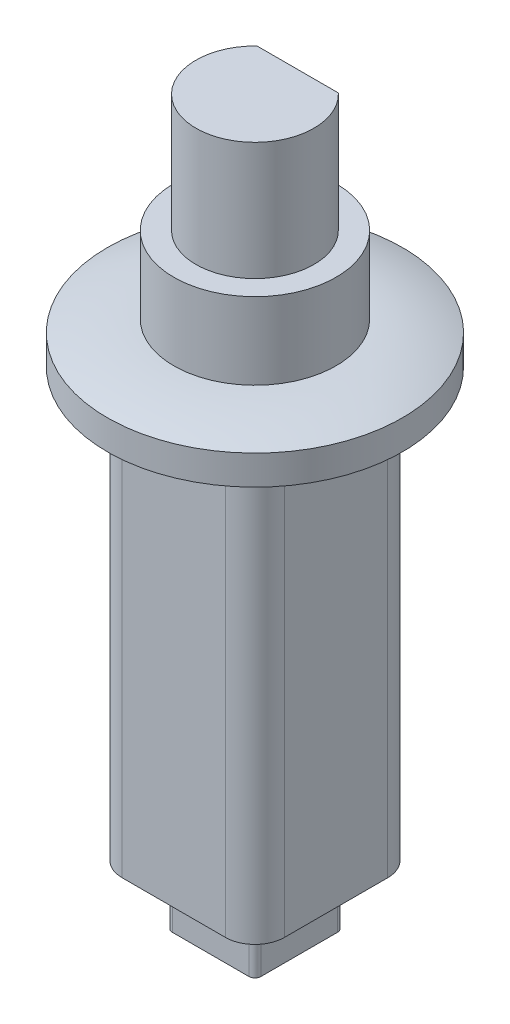
ISO-10303-21;
HEADER;
FILE_DESCRIPTION(('STEP AP214'),'2;1');
FILE_NAME('part.step','',(''),(''),'','','');
FILE_SCHEMA(('AUTOMOTIVE_DESIGN { 1 0 10303 214 1 1 1 1 }'));
ENDSEC;
DATA;
#1=APPLICATION_CONTEXT('core data for automotive mechanical design processes');
#2=APPLICATION_PROTOCOL_DEFINITION('international standard','automotive_design',2000,#1);
#3=PRODUCT_CONTEXT('',#1,'mechanical');
#4=PRODUCT('Part','Part','',(#3));
#5=PRODUCT_RELATED_PRODUCT_CATEGORY('part','',(#4));
#6=PRODUCT_DEFINITION_FORMATION('','',#4);
#7=PRODUCT_DEFINITION_CONTEXT('part definition',#1,'design');
#8=PRODUCT_DEFINITION('design','',#6,#7);
#9=PRODUCT_DEFINITION_SHAPE('','',#8);
#10=(LENGTH_UNIT() NAMED_UNIT(*) SI_UNIT(.MILLI.,.METRE.));
#11=(NAMED_UNIT(*) PLANE_ANGLE_UNIT() SI_UNIT($,.RADIAN.));
#12=(NAMED_UNIT(*) SI_UNIT($,.STERADIAN.) SOLID_ANGLE_UNIT());
#13=UNCERTAINTY_MEASURE_WITH_UNIT(LENGTH_MEASURE(1.E-05),#10,'distance_accuracy_value','');
#14=(GEOMETRIC_REPRESENTATION_CONTEXT(3) GLOBAL_UNCERTAINTY_ASSIGNED_CONTEXT((#13)) GLOBAL_UNIT_ASSIGNED_CONTEXT((#10,
#11,#12)) REPRESENTATION_CONTEXT('',''));
#15=CARTESIAN_POINT('',(0.,0.,0.));
#16=DIRECTION('',(0.,0.,1.));
#17=DIRECTION('',(1.,0.,0.));
#18=AXIS2_PLACEMENT_3D('',#15,#16,#17);
#19=CARTESIAN_POINT('',(1.75,-14.5,1.75));
#20=DIRECTION('',(0.,1.,0.));
#21=DIRECTION('',(-1.,0.,0.));
#22=AXIS2_PLACEMENT_3D('',#19,#20,#21);
#23=PLANE('',#22);
#24=CARTESIAN_POINT('',(1.75,-14.5,1.75));
#25=DIRECTION('',(0.,-1.,0.));
#26=DIRECTION('',(-1.,0.,0.));
#27=AXIS2_PLACEMENT_3D('',#24,#25,#26);
#28=CIRCLE('',#27,1.);
#29=CARTESIAN_POINT('',(2.75,-14.5,1.74999999999999));
#30=VERTEX_POINT('',#29);
#31=CARTESIAN_POINT('',(1.74999999999999,-14.5,2.75));
#32=VERTEX_POINT('',#31);
#33=EDGE_CURVE('E186',#30,#32,#28,.T.);
#34=ORIENTED_EDGE('',*,*,#33,.T.);
#35=DIRECTION('',(-1.,0.,0.));
#36=VECTOR('',#35,1.);
#37=CARTESIAN_POINT('',(-1.74999999999999,-14.5,2.75));
#38=LINE('',#37,#36);
#39=CARTESIAN_POINT('',(-1.74999999999999,-14.5,2.75));
#40=VERTEX_POINT('',#39);
#41=EDGE_CURVE('E189',#32,#40,#38,.T.);
#42=ORIENTED_EDGE('',*,*,#41,.T.);
#43=CARTESIAN_POINT('',(-1.75,-14.5,1.75));
#44=DIRECTION('',(0.,-1.,0.));
#45=DIRECTION('',(-1.,0.,0.));
#46=AXIS2_PLACEMENT_3D('',#43,#44,#45);
#47=CIRCLE('',#46,1.);
#48=CARTESIAN_POINT('',(-2.75,-14.5,1.74999999999999));
#49=VERTEX_POINT('',#48);
#50=EDGE_CURVE('E192',#40,#49,#47,.T.);
#51=ORIENTED_EDGE('',*,*,#50,.T.);
#52=DIRECTION('',(0.,0.,-1.));
#53=VECTOR('',#52,1.);
#54=CARTESIAN_POINT('',(-2.75,-14.5,-1.74999999999999));
#55=LINE('',#54,#53);
#56=CARTESIAN_POINT('',(-2.75,-14.5,-1.74999999999999));
#57=VERTEX_POINT('',#56);
#58=EDGE_CURVE('E194',#49,#57,#55,.T.);
#59=ORIENTED_EDGE('',*,*,#58,.T.);
#60=CARTESIAN_POINT('',(-1.75,-14.5,-1.75));
#61=DIRECTION('',(0.,-1.,0.));
#62=DIRECTION('',(-1.,0.,0.));
#63=AXIS2_PLACEMENT_3D('',#60,#61,#62);
#64=CIRCLE('',#63,1.);
#65=CARTESIAN_POINT('',(-1.74999999999999,-14.5,-2.75));
#66=VERTEX_POINT('',#65);
#67=EDGE_CURVE('E196',#57,#66,#64,.T.);
#68=ORIENTED_EDGE('',*,*,#67,.T.);
#69=DIRECTION('',(1.,0.,0.));
#70=VECTOR('',#69,1.);
#71=CARTESIAN_POINT('',(-1.74999999999999,-14.5,-2.75));
#72=LINE('',#71,#70);
#73=CARTESIAN_POINT('',(1.74999999999999,-14.5,-2.75));
#74=VERTEX_POINT('',#73);
#75=EDGE_CURVE('E198',#66,#74,#72,.T.);
#76=ORIENTED_EDGE('',*,*,#75,.T.);
#77=CARTESIAN_POINT('',(1.75,-14.5,-1.75));
#78=DIRECTION('',(0.,-1.,0.));
#79=DIRECTION('',(1.,0.,0.));
#80=AXIS2_PLACEMENT_3D('',#77,#78,#79);
#81=CIRCLE('',#80,1.);
#82=CARTESIAN_POINT('',(2.75,-14.5,-1.75));
#83=VERTEX_POINT('',#82);
#84=EDGE_CURVE('E200',#74,#83,#81,.T.);
#85=ORIENTED_EDGE('',*,*,#84,.T.);
#86=DIRECTION('',(0.,0.,1.));
#87=VECTOR('',#86,1.);
#88=CARTESIAN_POINT('',(2.75,-14.5,-1.74999999999999));
#89=LINE('',#88,#87);
#90=EDGE_CURVE('E202',#83,#30,#89,.T.);
#91=ORIENTED_EDGE('',*,*,#90,.T.);
#92=EDGE_LOOP('',(#34,#42,#51,#59,#68,#76,#85,#91));
#93=FACE_BOUND('',#92,.T.);
#94=CARTESIAN_POINT('',(1.3,-14.5,1.3));
#95=DIRECTION('',(0.,-1.,0.));
#96=DIRECTION('',(1.,0.,0.));
#97=AXIS2_PLACEMENT_3D('',#94,#95,#96);
#98=CIRCLE('',#97,0.2);
#99=CARTESIAN_POINT('',(1.5,-14.5,1.3));
#100=VERTEX_POINT('',#99);
#101=CARTESIAN_POINT('',(1.3,-14.5,1.5));
#102=VERTEX_POINT('',#101);
#103=EDGE_CURVE('E47',#100,#102,#98,.T.);
#104=ORIENTED_EDGE('',*,*,#103,.F.);
#105=DIRECTION('',(0.,0.,1.));
#106=VECTOR('',#105,1.);
#107=CARTESIAN_POINT('',(1.5,-14.5,-1.3));
#108=LINE('',#107,#106);
#109=CARTESIAN_POINT('',(1.5,-14.5,-1.3));
#110=VERTEX_POINT('',#109);
#111=EDGE_CURVE('E51',#110,#100,#108,.T.);
#112=ORIENTED_EDGE('',*,*,#111,.F.);
#113=CARTESIAN_POINT('',(1.3,-14.5,-1.3));
#114=DIRECTION('',(0.,-1.,0.));
#115=DIRECTION('',(1.,0.,0.));
#116=AXIS2_PLACEMENT_3D('',#113,#114,#115);
#117=CIRCLE('',#116,0.2);
#118=CARTESIAN_POINT('',(1.3,-14.5,-1.5));
#119=VERTEX_POINT('',#118);
#120=EDGE_CURVE('E531',#119,#110,#117,.T.);
#121=ORIENTED_EDGE('',*,*,#120,.F.);
#122=DIRECTION('',(1.,0.,0.));
#123=VECTOR('',#122,1.);
#124=CARTESIAN_POINT('',(1.3,-14.5,-1.5));
#125=LINE('',#124,#123);
#126=CARTESIAN_POINT('',(-1.3,-14.5,-1.5));
#127=VERTEX_POINT('',#126);
#128=EDGE_CURVE('E565',#127,#119,#125,.T.);
#129=ORIENTED_EDGE('',*,*,#128,.F.);
#130=CARTESIAN_POINT('',(-1.3,-14.5,-1.3));
#131=DIRECTION('',(0.,-1.,0.));
#132=DIRECTION('',(-1.,0.,0.));
#133=AXIS2_PLACEMENT_3D('',#130,#131,#132);
#134=CIRCLE('',#133,0.2);
#135=CARTESIAN_POINT('',(-1.5,-14.5,-1.3));
#136=VERTEX_POINT('',#135);
#137=EDGE_CURVE('E558',#136,#127,#134,.T.);
#138=ORIENTED_EDGE('',*,*,#137,.F.);
#139=DIRECTION('',(0.,0.,-1.));
#140=VECTOR('',#139,1.);
#141=CARTESIAN_POINT('',(-1.5,-14.5,-1.3));
#142=LINE('',#141,#140);
#143=CARTESIAN_POINT('',(-1.5,-14.5,1.3));
#144=VERTEX_POINT('',#143);
#145=EDGE_CURVE('E552',#144,#136,#142,.T.);
#146=ORIENTED_EDGE('',*,*,#145,.F.);
#147=CARTESIAN_POINT('',(-1.3,-14.5,1.3));
#148=DIRECTION('',(0.,-1.,0.));
#149=DIRECTION('',(1.,0.,0.));
#150=AXIS2_PLACEMENT_3D('',#147,#148,#149);
#151=CIRCLE('',#150,0.2);
#152=CARTESIAN_POINT('',(-1.3,-14.5,1.5));
#153=VERTEX_POINT('',#152);
#154=EDGE_CURVE('E555',#153,#144,#151,.T.);
#155=ORIENTED_EDGE('',*,*,#154,.F.);
#156=DIRECTION('',(-1.,0.,0.));
#157=VECTOR('',#156,1.);
#158=CARTESIAN_POINT('',(1.3,-14.5,1.5));
#159=LINE('',#158,#157);
#160=EDGE_CURVE('E556',#102,#153,#159,.T.);
#161=ORIENTED_EDGE('',*,*,#160,.F.);
#162=EDGE_LOOP('',(#104,#112,#121,#129,#138,#146,#155,#161));
#163=FACE_BOUND('',#162,.T.);
#164=ADVANCED_FACE('F32',(#93,#163),#23,.F.);
#165=CARTESIAN_POINT('',(5.,0.,0.));
#166=DIRECTION('',(0.,1.,0.));
#167=DIRECTION('',(-1.,0.,0.));
#168=AXIS2_PLACEMENT_3D('',#165,#166,#167);
#169=PLANE('',#168);
#170=CARTESIAN_POINT('',(0.,0.,0.));
#171=DIRECTION('',(0.,1.,0.));
#172=DIRECTION('',(-1.,0.,0.));
#173=AXIS2_PLACEMENT_3D('',#170,#171,#172);
#174=CIRCLE('',#173,5.);
#175=CARTESIAN_POINT('',(-5.,0.,0.));
#176=VERTEX_POINT('',#175);
#177=EDGE_CURVE('E256',#176,#176,#174,.T.);
#178=ORIENTED_EDGE('',*,*,#177,.F.);
#179=EDGE_LOOP('',(#178));
#180=FACE_BOUND('',#179,.T.);
#181=CARTESIAN_POINT('',(1.75,0.,1.75));
#182=DIRECTION('',(0.,-1.,0.));
#183=DIRECTION('',(-1.,0.,0.));
#184=AXIS2_PLACEMENT_3D('',#181,#182,#183);
#185=CIRCLE('',#184,1.);
#186=CARTESIAN_POINT('',(2.75,0.,1.74999999999999));
#187=VERTEX_POINT('',#186);
#188=CARTESIAN_POINT('',(1.74999999999999,0.,2.75));
#189=VERTEX_POINT('',#188);
#190=EDGE_CURVE('E177',#187,#189,#185,.T.);
#191=ORIENTED_EDGE('',*,*,#190,.F.);
#192=DIRECTION('',(0.,0.,1.));
#193=VECTOR('',#192,1.);
#194=CARTESIAN_POINT('',(2.75,0.,-1.74999999999999));
#195=LINE('',#194,#193);
#196=CARTESIAN_POINT('',(2.75,0.,-1.75));
#197=VERTEX_POINT('',#196);
#198=EDGE_CURVE('E190',#197,#187,#195,.T.);
#199=ORIENTED_EDGE('',*,*,#198,.F.);
#200=CARTESIAN_POINT('',(1.75,0.,-1.75));
#201=DIRECTION('',(0.,-1.,0.));
#202=DIRECTION('',(1.,0.,0.));
#203=AXIS2_PLACEMENT_3D('',#200,#201,#202);
#204=CIRCLE('',#203,1.);
#205=CARTESIAN_POINT('',(1.74999999999999,0.,-2.75));
#206=VERTEX_POINT('',#205);
#207=EDGE_CURVE('E219',#206,#197,#204,.T.);
#208=ORIENTED_EDGE('',*,*,#207,.F.);
#209=DIRECTION('',(1.,0.,0.));
#210=VECTOR('',#209,1.);
#211=CARTESIAN_POINT('',(-1.74999999999999,0.,-2.75));
#212=LINE('',#211,#210);
#213=CARTESIAN_POINT('',(-1.74999999999999,0.,-2.75));
#214=VERTEX_POINT('',#213);
#215=EDGE_CURVE('E216',#214,#206,#212,.T.);
#216=ORIENTED_EDGE('',*,*,#215,.F.);
#217=CARTESIAN_POINT('',(-1.75,0.,-1.75));
#218=DIRECTION('',(0.,-1.,0.));
#219=DIRECTION('',(-1.,0.,0.));
#220=AXIS2_PLACEMENT_3D('',#217,#218,#219);
#221=CIRCLE('',#220,1.);
#222=CARTESIAN_POINT('',(-2.75,0.,-1.74999999999999));
#223=VERTEX_POINT('',#222);
#224=EDGE_CURVE('E213',#223,#214,#221,.T.);
#225=ORIENTED_EDGE('',*,*,#224,.F.);
#226=DIRECTION('',(0.,0.,-1.));
#227=VECTOR('',#226,1.);
#228=CARTESIAN_POINT('',(-2.75,0.,-1.74999999999999));
#229=LINE('',#228,#227);
#230=CARTESIAN_POINT('',(-2.75,0.,1.74999999999999));
#231=VERTEX_POINT('',#230);
#232=EDGE_CURVE('E210',#231,#223,#229,.T.);
#233=ORIENTED_EDGE('',*,*,#232,.F.);
#234=CARTESIAN_POINT('',(-1.75,0.,1.75));
#235=DIRECTION('',(0.,-1.,0.));
#236=DIRECTION('',(-1.,0.,0.));
#237=AXIS2_PLACEMENT_3D('',#234,#235,#236);
#238=CIRCLE('',#237,1.);
#239=CARTESIAN_POINT('',(-1.74999999999999,0.,2.75));
#240=VERTEX_POINT('',#239);
#241=EDGE_CURVE('E207',#240,#231,#238,.T.);
#242=ORIENTED_EDGE('',*,*,#241,.F.);
#243=DIRECTION('',(-1.,0.,0.));
#244=VECTOR('',#243,1.);
#245=CARTESIAN_POINT('',(-1.74999999999999,0.,2.75));
#246=LINE('',#245,#244);
#247=EDGE_CURVE('E180',#189,#240,#246,.T.);
#248=ORIENTED_EDGE('',*,*,#247,.F.);
#249=EDGE_LOOP('',(#191,#199,#208,#216,#225,#233,#242,#248));
#250=FACE_BOUND('',#249,.T.);
#251=ADVANCED_FACE('F282',(#180,#250),#169,.F.);
#252=CARTESIAN_POINT('',(0.,8.,0.));
#253=DIRECTION('',(0.,-1.,0.));
#254=DIRECTION('',(1.,0.,0.));
#255=AXIS2_PLACEMENT_3D('',#252,#253,#254);
#256=PLANE('',#255);
#257=CARTESIAN_POINT('',(0.,8.,0.));
#258=DIRECTION('',(0.,1.,0.));
#259=DIRECTION('',(-1.,0.,0.));
#260=AXIS2_PLACEMENT_3D('',#257,#258,#259);
#261=CIRCLE('',#260,2.);
#262=CARTESIAN_POINT('',(-1.37749773139559,8.,-1.45));
#263=VERTEX_POINT('',#262);
#264=CARTESIAN_POINT('',(1.37749773139559,8.,-1.45));
#265=VERTEX_POINT('',#264);
#266=EDGE_CURVE('E11',#263,#265,#261,.T.);
#267=ORIENTED_EDGE('',*,*,#266,.T.);
#268=DIRECTION('',(1.,0.,0.));
#269=VECTOR('',#268,1.);
#270=CARTESIAN_POINT('',(-1.37749773139559,8.,-1.45));
#271=LINE('',#270,#269);
#272=EDGE_CURVE('E247',#263,#265,#271,.T.);
#273=ORIENTED_EDGE('',*,*,#272,.F.);
#274=EDGE_LOOP('',(#267,#273));
#275=FACE_BOUND('',#274,.T.);
#276=ADVANCED_FACE('F34',(#275),#256,.F.);
#277=CARTESIAN_POINT('',(0.,8.,0.));
#278=DIRECTION('',(0.,1.,0.));
#279=DIRECTION('',(-1.,0.,0.));
#280=AXIS2_PLACEMENT_3D('',#277,#278,#279);
#281=CYLINDRICAL_SURFACE('',#280,2.);
#282=CARTESIAN_POINT('',(0.,4.,0.));
#283=DIRECTION('',(0.,1.,0.));
#284=DIRECTION('',(-1.,0.,0.));
#285=AXIS2_PLACEMENT_3D('',#282,#283,#284);
#286=CIRCLE('',#285,2.);
#287=CARTESIAN_POINT('',(-1.37749773139559,4.,-1.45));
#288=VERTEX_POINT('',#287);
#289=CARTESIAN_POINT('',(1.37749773139559,4.,-1.45));
#290=VERTEX_POINT('',#289);
#291=EDGE_CURVE('E40',#288,#290,#286,.T.);
#292=ORIENTED_EDGE('',*,*,#291,.T.);
#293=DIRECTION('',(0.,1.,0.));
#294=VECTOR('',#293,1.);
#295=CARTESIAN_POINT('',(1.37749773139559,1.19064064242397,-1.45));
#296=LINE('',#295,#294);
#297=EDGE_CURVE('E251',#290,#265,#296,.T.);
#298=ORIENTED_EDGE('',*,*,#297,.T.);
#299=ORIENTED_EDGE('',*,*,#266,.F.);
#300=DIRECTION('',(0.,1.,0.));
#301=VECTOR('',#300,1.);
#302=CARTESIAN_POINT('',(-1.37749773139559,1.19064064242397,-1.45));
#303=LINE('',#302,#301);
#304=EDGE_CURVE('E254',#288,#263,#303,.T.);
#305=ORIENTED_EDGE('',*,*,#304,.F.);
#306=EDGE_LOOP('',(#292,#298,#299,#305));
#307=FACE_BOUND('',#306,.T.);
#308=ADVANCED_FACE('F271',(#307),#281,.T.);
#309=CARTESIAN_POINT('',(2.,4.,0.));
#310=DIRECTION('',(0.,-1.,0.));
#311=DIRECTION('',(1.,0.,0.));
#312=AXIS2_PLACEMENT_3D('',#309,#310,#311);
#313=PLANE('',#312);
#314=ORIENTED_EDGE('',*,*,#291,.F.);
#315=DIRECTION('',(1.,0.,0.));
#316=VECTOR('',#315,1.);
#317=CARTESIAN_POINT('',(-1.37749773139559,4.,-1.45));
#318=LINE('',#317,#316);
#319=EDGE_CURVE('E249',#288,#290,#318,.T.);
#320=ORIENTED_EDGE('',*,*,#319,.T.);
#321=EDGE_LOOP('',(#314,#320));
#322=FACE_BOUND('',#321,.T.);
#323=CARTESIAN_POINT('',(0.,4.,0.));
#324=DIRECTION('',(0.,1.,0.));
#325=DIRECTION('',(-1.,0.,0.));
#326=AXIS2_PLACEMENT_3D('',#323,#324,#325);
#327=CIRCLE('',#326,2.75);
#328=CARTESIAN_POINT('',(-2.75,4.,0.));
#329=VERTEX_POINT('',#328);
#330=EDGE_CURVE('E265',#329,#329,#327,.T.);
#331=ORIENTED_EDGE('',*,*,#330,.T.);
#332=EDGE_LOOP('',(#331));
#333=FACE_BOUND('',#332,.T.);
#334=ADVANCED_FACE('F275',(#322,#333),#313,.F.);
#335=CARTESIAN_POINT('',(0.,8.,0.));
#336=DIRECTION('',(0.,1.,0.));
#337=DIRECTION('',(-1.,0.,0.));
#338=AXIS2_PLACEMENT_3D('',#335,#336,#337);
#339=CYLINDRICAL_SURFACE('',#338,2.75);
#340=ORIENTED_EDGE('',*,*,#330,.F.);
#341=EDGE_LOOP('',(#340));
#342=FACE_BOUND('',#341,.T.);
#343=CARTESIAN_POINT('',(0.,1.4,0.));
#344=DIRECTION('',(0.,1.,0.));
#345=DIRECTION('',(-1.,0.,0.));
#346=AXIS2_PLACEMENT_3D('',#343,#344,#345);
#347=CIRCLE('',#346,2.75);
#348=CARTESIAN_POINT('',(-2.75,1.4,0.));
#349=VERTEX_POINT('',#348);
#350=EDGE_CURVE('E262',#349,#349,#347,.T.);
#351=ORIENTED_EDGE('',*,*,#350,.T.);
#352=EDGE_LOOP('',(#351));
#353=FACE_BOUND('',#352,.T.);
#354=ADVANCED_FACE('F338',(#342,#353),#339,.T.);
#355=CARTESIAN_POINT('',(0.,-5.12812500000002,0.));
#356=DIRECTION('',(0.,1.,0.));
#357=DIRECTION('',(-1.,0.,0.));
#358=AXIS2_PLACEMENT_3D('',#355,#356,#357);
#359=DEGENERATE_TOROIDAL_SURFACE('',#358,2.75,6.52812500000002,.T.);
#360=ORIENTED_EDGE('',*,*,#350,.F.);
#361=EDGE_LOOP('',(#360));
#362=FACE_BOUND('',#361,.T.);
#363=CARTESIAN_POINT('',(0.,1.,0.));
#364=DIRECTION('',(0.,1.,0.));
#365=DIRECTION('',(-1.,0.,0.));
#366=AXIS2_PLACEMENT_3D('',#363,#364,#365);
#367=CIRCLE('',#366,5.);
#368=CARTESIAN_POINT('',(-5.,1.,0.));
#369=VERTEX_POINT('',#368);
#370=EDGE_CURVE('E259',#369,#369,#367,.T.);
#371=ORIENTED_EDGE('',*,*,#370,.T.);
#372=EDGE_LOOP('',(#371));
#373=FACE_BOUND('',#372,.T.);
#374=ADVANCED_FACE('F334',(#362,#373),#359,.T.);
#375=CARTESIAN_POINT('',(0.,8.,0.));
#376=DIRECTION('',(0.,1.,0.));
#377=DIRECTION('',(-1.,0.,0.));
#378=AXIS2_PLACEMENT_3D('',#375,#376,#377);
#379=CYLINDRICAL_SURFACE('',#378,5.);
#380=ORIENTED_EDGE('',*,*,#370,.F.);
#381=EDGE_LOOP('',(#380));
#382=FACE_BOUND('',#381,.T.);
#383=ORIENTED_EDGE('',*,*,#177,.T.);
#384=EDGE_LOOP('',(#383));
#385=FACE_BOUND('',#384,.T.);
#386=ADVANCED_FACE('F330',(#382,#385),#379,.T.);
#387=CARTESIAN_POINT('',(-1.37749773139559,1.19064064242397,-1.45));
#388=DIRECTION('',(0.,0.,1.));
#389=DIRECTION('',(1.,0.,0.));
#390=AXIS2_PLACEMENT_3D('',#387,#388,#389);
#391=PLANE('',#390);
#392=ORIENTED_EDGE('',*,*,#304,.T.);
#393=ORIENTED_EDGE('',*,*,#272,.T.);
#394=ORIENTED_EDGE('',*,*,#297,.F.);
#395=ORIENTED_EDGE('',*,*,#319,.F.);
#396=EDGE_LOOP('',(#392,#393,#394,#395));
#397=FACE_BOUND('',#396,.T.);
#398=ADVANCED_FACE('F278',(#397),#391,.F.);
#399=CARTESIAN_POINT('',(1.75,-14.5,1.75));
#400=DIRECTION('',(0.,1.,0.));
#401=DIRECTION('',(-1.,0.,0.));
#402=AXIS2_PLACEMENT_3D('',#399,#400,#401);
#403=CYLINDRICAL_SURFACE('',#402,1.);
#404=ORIENTED_EDGE('',*,*,#190,.T.);
#405=DIRECTION('',(0.,1.,0.));
#406=VECTOR('',#405,1.);
#407=CARTESIAN_POINT('',(1.74999999999999,-14.5,2.75));
#408=LINE('',#407,#406);
#409=EDGE_CURVE('E244',#32,#189,#408,.T.);
#410=ORIENTED_EDGE('',*,*,#409,.F.);
#411=ORIENTED_EDGE('',*,*,#33,.F.);
#412=DIRECTION('',(0.,1.,0.));
#413=VECTOR('',#412,1.);
#414=CARTESIAN_POINT('',(2.75,-14.5,1.74999999999999));
#415=LINE('',#414,#413);
#416=EDGE_CURVE('E203',#30,#187,#415,.T.);
#417=ORIENTED_EDGE('',*,*,#416,.T.);
#418=EDGE_LOOP('',(#404,#410,#411,#417));
#419=FACE_BOUND('',#418,.T.);
#420=ADVANCED_FACE('F324',(#419),#403,.T.);
#421=CARTESIAN_POINT('',(-1.74999999999999,-14.5,2.75));
#422=DIRECTION('',(0.,0.,-1.));
#423=DIRECTION('',(-1.,0.,0.));
#424=AXIS2_PLACEMENT_3D('',#421,#422,#423);
#425=PLANE('',#424);
#426=ORIENTED_EDGE('',*,*,#247,.T.);
#427=DIRECTION('',(0.,1.,0.));
#428=VECTOR('',#427,1.);
#429=CARTESIAN_POINT('',(-1.74999999999999,-14.5,2.75));
#430=LINE('',#429,#428);
#431=EDGE_CURVE('E241',#40,#240,#430,.T.);
#432=ORIENTED_EDGE('',*,*,#431,.F.);
#433=ORIENTED_EDGE('',*,*,#41,.F.);
#434=ORIENTED_EDGE('',*,*,#409,.T.);
#435=EDGE_LOOP('',(#426,#432,#433,#434));
#436=FACE_BOUND('',#435,.T.);
#437=ADVANCED_FACE('F320',(#436),#425,.F.);
#438=CARTESIAN_POINT('',(-1.75,-14.5,1.75));
#439=DIRECTION('',(0.,1.,0.));
#440=DIRECTION('',(-1.,0.,0.));
#441=AXIS2_PLACEMENT_3D('',#438,#439,#440);
#442=CYLINDRICAL_SURFACE('',#441,1.);
#443=ORIENTED_EDGE('',*,*,#241,.T.);
#444=DIRECTION('',(0.,1.,0.));
#445=VECTOR('',#444,1.);
#446=CARTESIAN_POINT('',(-2.75,-14.5,1.74999999999999));
#447=LINE('',#446,#445);
#448=EDGE_CURVE('E238',#49,#231,#447,.T.);
#449=ORIENTED_EDGE('',*,*,#448,.F.);
#450=ORIENTED_EDGE('',*,*,#50,.F.);
#451=ORIENTED_EDGE('',*,*,#431,.T.);
#452=EDGE_LOOP('',(#443,#449,#450,#451));
#453=FACE_BOUND('',#452,.T.);
#454=ADVANCED_FACE('F316',(#453),#442,.T.);
#455=CARTESIAN_POINT('',(-2.75,-14.5,-1.74999999999999));
#456=DIRECTION('',(1.,0.,0.));
#457=DIRECTION('',(0.,1.,0.));
#458=AXIS2_PLACEMENT_3D('',#455,#456,#457);
#459=PLANE('',#458);
#460=ORIENTED_EDGE('',*,*,#232,.T.);
#461=DIRECTION('',(0.,1.,0.));
#462=VECTOR('',#461,1.);
#463=CARTESIAN_POINT('',(-2.75,-14.5,-1.74999999999999));
#464=LINE('',#463,#462);
#465=EDGE_CURVE('E235',#57,#223,#464,.T.);
#466=ORIENTED_EDGE('',*,*,#465,.F.);
#467=ORIENTED_EDGE('',*,*,#58,.F.);
#468=ORIENTED_EDGE('',*,*,#448,.T.);
#469=EDGE_LOOP('',(#460,#466,#467,#468));
#470=FACE_BOUND('',#469,.T.);
#471=ADVANCED_FACE('F312',(#470),#459,.F.);
#472=CARTESIAN_POINT('',(-1.75,-14.5,-1.75));
#473=DIRECTION('',(0.,1.,0.));
#474=DIRECTION('',(-1.,0.,0.));
#475=AXIS2_PLACEMENT_3D('',#472,#473,#474);
#476=CYLINDRICAL_SURFACE('',#475,1.);
#477=ORIENTED_EDGE('',*,*,#224,.T.);
#478=DIRECTION('',(0.,1.,0.));
#479=VECTOR('',#478,1.);
#480=CARTESIAN_POINT('',(-1.74999999999999,-14.5,-2.75));
#481=LINE('',#480,#479);
#482=EDGE_CURVE('E232',#66,#214,#481,.T.);
#483=ORIENTED_EDGE('',*,*,#482,.F.);
#484=ORIENTED_EDGE('',*,*,#67,.F.);
#485=ORIENTED_EDGE('',*,*,#465,.T.);
#486=EDGE_LOOP('',(#477,#483,#484,#485));
#487=FACE_BOUND('',#486,.T.);
#488=ADVANCED_FACE('F308',(#487),#476,.T.);
#489=CARTESIAN_POINT('',(-1.74999999999999,-14.5,-2.75));
#490=DIRECTION('',(0.,0.,1.));
#491=DIRECTION('',(1.,0.,0.));
#492=AXIS2_PLACEMENT_3D('',#489,#490,#491);
#493=PLANE('',#492);
#494=ORIENTED_EDGE('',*,*,#215,.T.);
#495=DIRECTION('',(0.,1.,0.));
#496=VECTOR('',#495,1.);
#497=CARTESIAN_POINT('',(1.74999999999999,-14.5,-2.75));
#498=LINE('',#497,#496);
#499=EDGE_CURVE('E229',#74,#206,#498,.T.);
#500=ORIENTED_EDGE('',*,*,#499,.F.);
#501=ORIENTED_EDGE('',*,*,#75,.F.);
#502=ORIENTED_EDGE('',*,*,#482,.T.);
#503=EDGE_LOOP('',(#494,#500,#501,#502));
#504=FACE_BOUND('',#503,.T.);
#505=ADVANCED_FACE('F304',(#504),#493,.F.);
#506=CARTESIAN_POINT('',(1.75,-14.5,-1.75));
#507=DIRECTION('',(0.,1.,0.));
#508=DIRECTION('',(-1.,0.,0.));
#509=AXIS2_PLACEMENT_3D('',#506,#507,#508);
#510=CYLINDRICAL_SURFACE('',#509,1.);
#511=ORIENTED_EDGE('',*,*,#207,.T.);
#512=DIRECTION('',(0.,1.,0.));
#513=VECTOR('',#512,1.);
#514=CARTESIAN_POINT('',(2.75,-14.5,-1.75));
#515=LINE('',#514,#513);
#516=EDGE_CURVE('E226',#83,#197,#515,.T.);
#517=ORIENTED_EDGE('',*,*,#516,.F.);
#518=ORIENTED_EDGE('',*,*,#84,.F.);
#519=ORIENTED_EDGE('',*,*,#499,.T.);
#520=EDGE_LOOP('',(#511,#517,#518,#519));
#521=FACE_BOUND('',#520,.T.);
#522=ADVANCED_FACE('F300',(#521),#510,.T.);
#523=CARTESIAN_POINT('',(2.75,-14.5,-1.74999999999999));
#524=DIRECTION('',(-1.,0.,0.));
#525=DIRECTION('',(0.,-1.,0.));
#526=AXIS2_PLACEMENT_3D('',#523,#524,#525);
#527=PLANE('',#526);
#528=ORIENTED_EDGE('',*,*,#198,.T.);
#529=ORIENTED_EDGE('',*,*,#416,.F.);
#530=ORIENTED_EDGE('',*,*,#90,.F.);
#531=ORIENTED_EDGE('',*,*,#516,.T.);
#532=EDGE_LOOP('',(#528,#529,#530,#531));
#533=FACE_BOUND('',#532,.T.);
#534=ADVANCED_FACE('F297',(#533),#527,.F.);
#535=CARTESIAN_POINT('',(1.3,-16.5,1.3));
#536=DIRECTION('',(0.,1.,0.));
#537=DIRECTION('',(-1.,0.,0.));
#538=AXIS2_PLACEMENT_3D('',#535,#536,#537);
#539=CYLINDRICAL_SURFACE('',#538,0.2);
#540=ORIENTED_EDGE('',*,*,#103,.T.);
#541=DIRECTION('',(0.,1.,0.));
#542=VECTOR('',#541,1.);
#543=CARTESIAN_POINT('',(1.3,-16.5,1.5));
#544=LINE('',#543,#542);
#545=CARTESIAN_POINT('',(1.3,-16.5,1.5));
#546=VERTEX_POINT('',#545);
#547=EDGE_CURVE('E160',#546,#102,#544,.T.);
#548=ORIENTED_EDGE('',*,*,#547,.F.);
#549=CARTESIAN_POINT('',(1.3,-16.5,1.3));
#550=DIRECTION('',(0.,-1.,0.));
#551=DIRECTION('',(1.,0.,0.));
#552=AXIS2_PLACEMENT_3D('',#549,#550,#551);
#553=CIRCLE('',#552,0.2);
#554=CARTESIAN_POINT('',(1.5,-16.5,1.3));
#555=VERTEX_POINT('',#554);
#556=EDGE_CURVE('E166',#555,#546,#553,.T.);
#557=ORIENTED_EDGE('',*,*,#556,.F.);
#558=DIRECTION('',(0.,1.,0.));
#559=VECTOR('',#558,1.);
#560=CARTESIAN_POINT('',(1.5,-16.5,1.3));
#561=LINE('',#560,#559);
#562=EDGE_CURVE('E528',#555,#100,#561,.T.);
#563=ORIENTED_EDGE('',*,*,#562,.T.);
#564=EDGE_LOOP('',(#540,#548,#557,#563));
#565=FACE_BOUND('',#564,.T.);
#566=ADVANCED_FACE('F176',(#565),#539,.T.);
#567=CARTESIAN_POINT('',(1.3,-16.5,1.5));
#568=DIRECTION('',(0.,0.,-1.));
#569=DIRECTION('',(-1.,0.,0.));
#570=AXIS2_PLACEMENT_3D('',#567,#568,#569);
#571=PLANE('',#570);
#572=ORIENTED_EDGE('',*,*,#160,.T.);
#573=DIRECTION('',(0.,1.,0.));
#574=VECTOR('',#573,1.);
#575=CARTESIAN_POINT('',(-1.3,-16.5,1.5));
#576=LINE('',#575,#574);
#577=CARTESIAN_POINT('',(-1.3,-16.5,1.5));
#578=VERTEX_POINT('',#577);
#579=EDGE_CURVE('E162',#578,#153,#576,.T.);
#580=ORIENTED_EDGE('',*,*,#579,.F.);
#581=DIRECTION('',(-1.,0.,0.));
#582=VECTOR('',#581,1.);
#583=CARTESIAN_POINT('',(1.3,-16.5,1.5));
#584=LINE('',#583,#582);
#585=EDGE_CURVE('E155',#546,#578,#584,.T.);
#586=ORIENTED_EDGE('',*,*,#585,.F.);
#587=ORIENTED_EDGE('',*,*,#547,.T.);
#588=EDGE_LOOP('',(#572,#580,#586,#587));
#589=FACE_BOUND('',#588,.T.);
#590=ADVANCED_FACE('F158',(#589),#571,.F.);
#591=CARTESIAN_POINT('',(-1.3,-16.5,1.3));
#592=DIRECTION('',(0.,1.,0.));
#593=DIRECTION('',(-1.,0.,0.));
#594=AXIS2_PLACEMENT_3D('',#591,#592,#593);
#595=CYLINDRICAL_SURFACE('',#594,0.2);
#596=ORIENTED_EDGE('',*,*,#154,.T.);
#597=DIRECTION('',(0.,1.,0.));
#598=VECTOR('',#597,1.);
#599=CARTESIAN_POINT('',(-1.5,-16.5,1.3));
#600=LINE('',#599,#598);
#601=CARTESIAN_POINT('',(-1.5,-16.5,1.3));
#602=VERTEX_POINT('',#601);
#603=EDGE_CURVE('E182',#602,#144,#600,.T.);
#604=ORIENTED_EDGE('',*,*,#603,.F.);
#605=CARTESIAN_POINT('',(-1.3,-16.5,1.3));
#606=DIRECTION('',(0.,-1.,0.));
#607=DIRECTION('',(1.,0.,0.));
#608=AXIS2_PLACEMENT_3D('',#605,#606,#607);
#609=CIRCLE('',#608,0.2);
#610=EDGE_CURVE('E165',#578,#602,#609,.T.);
#611=ORIENTED_EDGE('',*,*,#610,.F.);
#612=ORIENTED_EDGE('',*,*,#579,.T.);
#613=EDGE_LOOP('',(#596,#604,#611,#612));
#614=FACE_BOUND('',#613,.T.);
#615=ADVANCED_FACE('F408',(#614),#595,.T.);
#616=CARTESIAN_POINT('',(-1.5,-16.5,-1.3));
#617=DIRECTION('',(1.,0.,0.));
#618=DIRECTION('',(0.,1.,0.));
#619=AXIS2_PLACEMENT_3D('',#616,#617,#618);
#620=PLANE('',#619);
#621=ORIENTED_EDGE('',*,*,#145,.T.);
#622=DIRECTION('',(0.,1.,0.));
#623=VECTOR('',#622,1.);
#624=CARTESIAN_POINT('',(-1.5,-16.5,-1.3));
#625=LINE('',#624,#623);
#626=CARTESIAN_POINT('',(-1.5,-16.5,-1.3));
#627=VERTEX_POINT('',#626);
#628=EDGE_CURVE('E545',#627,#136,#625,.T.);
#629=ORIENTED_EDGE('',*,*,#628,.F.);
#630=DIRECTION('',(0.,0.,-1.));
#631=VECTOR('',#630,1.);
#632=CARTESIAN_POINT('',(-1.5,-16.5,-1.3));
#633=LINE('',#632,#631);
#634=EDGE_CURVE('E553',#602,#627,#633,.T.);
#635=ORIENTED_EDGE('',*,*,#634,.F.);
#636=ORIENTED_EDGE('',*,*,#603,.T.);
#637=EDGE_LOOP('',(#621,#629,#635,#636));
#638=FACE_BOUND('',#637,.T.);
#639=ADVANCED_FACE('F414',(#638),#620,.F.);
#640=CARTESIAN_POINT('',(-1.3,-16.5,-1.3));
#641=DIRECTION('',(0.,1.,0.));
#642=DIRECTION('',(-1.,0.,0.));
#643=AXIS2_PLACEMENT_3D('',#640,#641,#642);
#644=CYLINDRICAL_SURFACE('',#643,0.2);
#645=ORIENTED_EDGE('',*,*,#137,.T.);
#646=DIRECTION('',(0.,1.,0.));
#647=VECTOR('',#646,1.);
#648=CARTESIAN_POINT('',(-1.3,-16.5,-1.5));
#649=LINE('',#648,#647);
#650=CARTESIAN_POINT('',(-1.3,-16.5,-1.5));
#651=VERTEX_POINT('',#650);
#652=EDGE_CURVE('E542',#651,#127,#649,.T.);
#653=ORIENTED_EDGE('',*,*,#652,.F.);
#654=CARTESIAN_POINT('',(-1.3,-16.5,-1.3));
#655=DIRECTION('',(0.,-1.,0.));
#656=DIRECTION('',(-1.,0.,0.));
#657=AXIS2_PLACEMENT_3D('',#654,#655,#656);
#658=CIRCLE('',#657,0.2);
#659=EDGE_CURVE('E573',#627,#651,#658,.T.);
#660=ORIENTED_EDGE('',*,*,#659,.F.);
#661=ORIENTED_EDGE('',*,*,#628,.T.);
#662=EDGE_LOOP('',(#645,#653,#660,#661));
#663=FACE_BOUND('',#662,.T.);
#664=ADVANCED_FACE('F422',(#663),#644,.T.);
#665=CARTESIAN_POINT('',(1.3,-16.5,-1.5));
#666=DIRECTION('',(0.,0.,1.));
#667=DIRECTION('',(1.,0.,0.));
#668=AXIS2_PLACEMENT_3D('',#665,#666,#667);
#669=PLANE('',#668);
#670=ORIENTED_EDGE('',*,*,#128,.T.);
#671=DIRECTION('',(0.,1.,0.));
#672=VECTOR('',#671,1.);
#673=CARTESIAN_POINT('',(1.3,-16.5,-1.5));
#674=LINE('',#673,#672);
#675=CARTESIAN_POINT('',(1.3,-16.5,-1.5));
#676=VERTEX_POINT('',#675);
#677=EDGE_CURVE('E534',#676,#119,#674,.T.);
#678=ORIENTED_EDGE('',*,*,#677,.F.);
#679=DIRECTION('',(1.,0.,0.));
#680=VECTOR('',#679,1.);
#681=CARTESIAN_POINT('',(1.3,-16.5,-1.5));
#682=LINE('',#681,#680);
#683=EDGE_CURVE('E571',#651,#676,#682,.T.);
#684=ORIENTED_EDGE('',*,*,#683,.F.);
#685=ORIENTED_EDGE('',*,*,#652,.T.);
#686=EDGE_LOOP('',(#670,#678,#684,#685));
#687=FACE_BOUND('',#686,.T.);
#688=ADVANCED_FACE('F430',(#687),#669,.F.);
#689=CARTESIAN_POINT('',(1.3,-16.5,-1.3));
#690=DIRECTION('',(0.,1.,0.));
#691=DIRECTION('',(-1.,0.,0.));
#692=AXIS2_PLACEMENT_3D('',#689,#690,#691);
#693=CYLINDRICAL_SURFACE('',#692,0.2);
#694=ORIENTED_EDGE('',*,*,#120,.T.);
#695=DIRECTION('',(0.,1.,0.));
#696=VECTOR('',#695,1.);
#697=CARTESIAN_POINT('',(1.5,-16.5,-1.3));
#698=LINE('',#697,#696);
#699=CARTESIAN_POINT('',(1.5,-16.5,-1.3));
#700=VERTEX_POINT('',#699);
#701=EDGE_CURVE('E530',#700,#110,#698,.T.);
#702=ORIENTED_EDGE('',*,*,#701,.F.);
#703=CARTESIAN_POINT('',(1.3,-16.5,-1.3));
#704=DIRECTION('',(0.,-1.,0.));
#705=DIRECTION('',(1.,0.,0.));
#706=AXIS2_PLACEMENT_3D('',#703,#704,#705);
#707=CIRCLE('',#706,0.2);
#708=EDGE_CURVE('E536',#676,#700,#707,.T.);
#709=ORIENTED_EDGE('',*,*,#708,.F.);
#710=ORIENTED_EDGE('',*,*,#677,.T.);
#711=EDGE_LOOP('',(#694,#702,#709,#710));
#712=FACE_BOUND('',#711,.T.);
#713=ADVANCED_FACE('F438',(#712),#693,.T.);
#714=CARTESIAN_POINT('',(1.5,-16.5,-1.3));
#715=DIRECTION('',(-1.,0.,0.));
#716=DIRECTION('',(0.,-1.,0.));
#717=AXIS2_PLACEMENT_3D('',#714,#715,#716);
#718=PLANE('',#717);
#719=ORIENTED_EDGE('',*,*,#111,.T.);
#720=ORIENTED_EDGE('',*,*,#562,.F.);
#721=DIRECTION('',(0.,0.,1.));
#722=VECTOR('',#721,1.);
#723=CARTESIAN_POINT('',(1.5,-16.5,-1.3));
#724=LINE('',#723,#722);
#725=EDGE_CURVE('E171',#700,#555,#724,.T.);
#726=ORIENTED_EDGE('',*,*,#725,.F.);
#727=ORIENTED_EDGE('',*,*,#701,.T.);
#728=EDGE_LOOP('',(#719,#720,#726,#727));
#729=FACE_BOUND('',#728,.T.);
#730=ADVANCED_FACE('F446',(#729),#718,.F.);
#731=CARTESIAN_POINT('',(1.3,-16.5,1.3));
#732=DIRECTION('',(0.,-1.,0.));
#733=DIRECTION('',(1.,0.,0.));
#734=AXIS2_PLACEMENT_3D('',#731,#732,#733);
#735=PLANE('',#734);
#736=ORIENTED_EDGE('',*,*,#556,.T.);
#737=ORIENTED_EDGE('',*,*,#585,.T.);
#738=ORIENTED_EDGE('',*,*,#610,.T.);
#739=ORIENTED_EDGE('',*,*,#634,.T.);
#740=ORIENTED_EDGE('',*,*,#659,.T.);
#741=ORIENTED_EDGE('',*,*,#683,.T.);
#742=ORIENTED_EDGE('',*,*,#708,.T.);
#743=ORIENTED_EDGE('',*,*,#725,.T.);
#744=EDGE_LOOP('',(#736,#737,#738,#739,#740,#741,#742,#743));
#745=FACE_BOUND('',#744,.T.);
#746=ADVANCED_FACE('F169',(#745),#735,.T.);
#747=CLOSED_SHELL('',(#164,#251,#276,#308,#334,#354,#374,#386,#398,#420,#437,#454,#471,#488,
#505,#522,#534,#566,#590,#615,#639,#664,#688,#713,#730,#746));
#748=MANIFOLD_SOLID_BREP('B2',#747);
#749=ADVANCED_BREP_SHAPE_REPRESENTATION('',(#18,#748),#14);
#750=SHAPE_DEFINITION_REPRESENTATION(#9,#749);
ENDSEC;
END-ISO-10303-21;
